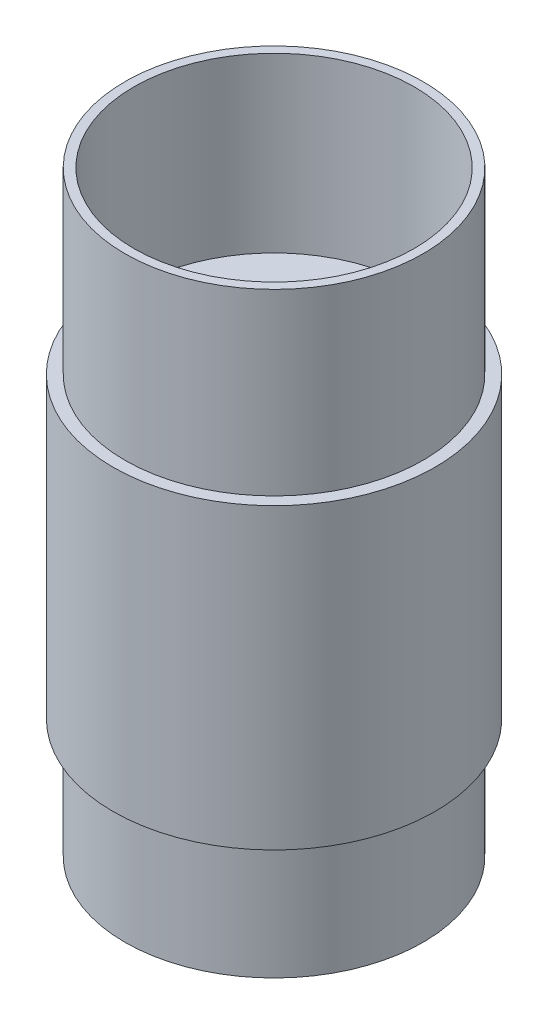
ISO-10303-21;
HEADER;
FILE_DESCRIPTION(('STEP AP214'),'2;1');
FILE_NAME('part.step','',(''),(''),'','','');
FILE_SCHEMA(('AUTOMOTIVE_DESIGN { 1 0 10303 214 1 1 1 1 }'));
ENDSEC;
DATA;
#1=APPLICATION_CONTEXT('core data for automotive mechanical design processes');
#2=APPLICATION_PROTOCOL_DEFINITION('international standard','automotive_design',2000,#1);
#3=PRODUCT_CONTEXT('',#1,'mechanical');
#4=PRODUCT('Part','Part','',(#3));
#5=PRODUCT_RELATED_PRODUCT_CATEGORY('part','',(#4));
#6=PRODUCT_DEFINITION_FORMATION('','',#4);
#7=PRODUCT_DEFINITION_CONTEXT('part definition',#1,'design');
#8=PRODUCT_DEFINITION('design','',#6,#7);
#9=PRODUCT_DEFINITION_SHAPE('','',#8);
#10=(LENGTH_UNIT() NAMED_UNIT(*) SI_UNIT(.MILLI.,.METRE.));
#11=(NAMED_UNIT(*) PLANE_ANGLE_UNIT() SI_UNIT($,.RADIAN.));
#12=(NAMED_UNIT(*) SI_UNIT($,.STERADIAN.) SOLID_ANGLE_UNIT());
#13=UNCERTAINTY_MEASURE_WITH_UNIT(LENGTH_MEASURE(1.E-05),#10,'distance_accuracy_value','');
#14=(GEOMETRIC_REPRESENTATION_CONTEXT(3) GLOBAL_UNCERTAINTY_ASSIGNED_CONTEXT((#13)) GLOBAL_UNIT_ASSIGNED_CONTEXT((#10,
#11,#12)) REPRESENTATION_CONTEXT('',''));
#15=CARTESIAN_POINT('',(0.,0.,0.));
#16=DIRECTION('',(0.,0.,1.));
#17=DIRECTION('',(1.,0.,0.));
#18=AXIS2_PLACEMENT_3D('',#15,#16,#17);
#19=CARTESIAN_POINT('',(0.,100.,0.));
#20=DIRECTION('',(0.,1.,0.));
#21=DIRECTION('',(0.,0.,1.));
#22=AXIS2_PLACEMENT_3D('',#19,#20,#21);
#23=PLANE('',#22);
#24=CARTESIAN_POINT('',(0.,100.,0.));
#25=DIRECTION('',(0.,1.,0.));
#26=DIRECTION('',(0.,0.,1.));
#27=AXIS2_PLACEMENT_3D('',#24,#25,#26);
#28=CIRCLE('',#27,25.);
#29=CARTESIAN_POINT('',(0.,100.,25.));
#30=VERTEX_POINT('',#29);
#31=EDGE_CURVE('E73',#30,#30,#28,.T.);
#32=ORIENTED_EDGE('',*,*,#31,.T.);
#33=EDGE_LOOP('',(#32));
#34=FACE_BOUND('',#33,.T.);
#35=CARTESIAN_POINT('',(0.,100.,0.));
#36=DIRECTION('',(0.,1.,0.));
#37=DIRECTION('',(0.,0.,1.));
#38=AXIS2_PLACEMENT_3D('',#35,#36,#37);
#39=CIRCLE('',#38,23.5);
#40=CARTESIAN_POINT('',(0.,100.,23.5));
#41=VERTEX_POINT('',#40);
#42=EDGE_CURVE('E82',#41,#41,#39,.T.);
#43=ORIENTED_EDGE('',*,*,#42,.F.);
#44=EDGE_LOOP('',(#43));
#45=FACE_BOUND('',#44,.T.);
#46=ADVANCED_FACE('F66',(#34,#45),#23,.T.);
#47=CARTESIAN_POINT('',(0.,70.,0.));
#48=DIRECTION('',(0.,1.,0.));
#49=DIRECTION('',(0.,0.,1.));
#50=AXIS2_PLACEMENT_3D('',#47,#48,#49);
#51=PLANE('',#50);
#52=CARTESIAN_POINT('',(0.,70.,0.));
#53=DIRECTION('',(0.,1.,0.));
#54=DIRECTION('',(0.,0.,1.));
#55=AXIS2_PLACEMENT_3D('',#52,#53,#54);
#56=CIRCLE('',#55,25.);
#57=CARTESIAN_POINT('',(0.,70.,25.));
#58=VERTEX_POINT('',#57);
#59=EDGE_CURVE('E77',#58,#58,#56,.T.);
#60=ORIENTED_EDGE('',*,*,#59,.F.);
#61=EDGE_LOOP('',(#60));
#62=FACE_BOUND('',#61,.T.);
#63=ADVANCED_FACE('F90',(#62),#51,.F.);
#64=CARTESIAN_POINT('',(0.,100.,0.));
#65=DIRECTION('',(0.,-1.,0.));
#66=DIRECTION('',(0.,0.,-1.));
#67=AXIS2_PLACEMENT_3D('',#64,#65,#66);
#68=CYLINDRICAL_SURFACE('',#67,25.);
#69=ORIENTED_EDGE('',*,*,#31,.F.);
#70=EDGE_LOOP('',(#69));
#71=FACE_BOUND('',#70,.T.);
#72=ORIENTED_EDGE('',*,*,#59,.T.);
#73=EDGE_LOOP('',(#72));
#74=FACE_BOUND('',#73,.T.);
#75=ADVANCED_FACE('F68',(#71,#74),#68,.T.);
#76=CARTESIAN_POINT('',(0.,100.,0.));
#77=DIRECTION('',(0.,-1.,0.));
#78=DIRECTION('',(0.,0.,-1.));
#79=AXIS2_PLACEMENT_3D('',#76,#77,#78);
#80=CYLINDRICAL_SURFACE('',#79,23.5);
#81=CARTESIAN_POINT('',(0.,71.,0.));
#82=DIRECTION('',(0.,1.,0.));
#83=DIRECTION('',(0.,0.,1.));
#84=AXIS2_PLACEMENT_3D('',#81,#82,#83);
#85=CIRCLE('',#84,23.5);
#86=CARTESIAN_POINT('',(0.,71.,23.5));
#87=VERTEX_POINT('',#86);
#88=EDGE_CURVE('E12',#87,#87,#85,.T.);
#89=ORIENTED_EDGE('',*,*,#88,.F.);
#90=EDGE_LOOP('',(#89));
#91=FACE_BOUND('',#90,.T.);
#92=ORIENTED_EDGE('',*,*,#42,.T.);
#93=EDGE_LOOP('',(#92));
#94=FACE_BOUND('',#93,.T.);
#95=ADVANCED_FACE('F87',(#91,#94),#80,.F.);
#96=CARTESIAN_POINT('',(0.,71.,0.));
#97=DIRECTION('',(0.,1.,0.));
#98=DIRECTION('',(0.,0.,1.));
#99=AXIS2_PLACEMENT_3D('',#96,#97,#98);
#100=PLANE('',#99);
#101=ORIENTED_EDGE('',*,*,#88,.T.);
#102=EDGE_LOOP('',(#101));
#103=FACE_BOUND('',#102,.T.);
#104=ADVANCED_FACE('F99',(#103),#100,.T.);
#105=CLOSED_SHELL('',(#46,#63,#75,#95,#104));
#106=MANIFOLD_SOLID_BREP('B2',#105);
#107=CARTESIAN_POINT('',(0.,70.,0.));
#108=DIRECTION('',(0.,1.,0.));
#109=DIRECTION('',(0.,0.,1.));
#110=AXIS2_PLACEMENT_3D('',#107,#108,#109);
#111=PLANE('',#110);
#112=CARTESIAN_POINT('',(0.,70.,0.));
#113=DIRECTION('',(0.,1.,0.));
#114=DIRECTION('',(0.,0.,1.));
#115=AXIS2_PLACEMENT_3D('',#112,#113,#114);
#116=CIRCLE('',#115,27.);
#117=CARTESIAN_POINT('',(0.,70.,27.));
#118=VERTEX_POINT('',#117);
#119=EDGE_CURVE('E65',#118,#118,#116,.T.);
#120=ORIENTED_EDGE('',*,*,#119,.T.);
#121=EDGE_LOOP('',(#120));
#122=FACE_BOUND('',#121,.T.);
#123=CARTESIAN_POINT('',(0.,70.,0.));
#124=DIRECTION('',(0.,1.,0.));
#125=DIRECTION('',(0.,0.,1.));
#126=AXIS2_PLACEMENT_3D('',#123,#124,#125);
#127=CIRCLE('',#126,25.);
#128=CARTESIAN_POINT('',(0.,70.,25.));
#129=VERTEX_POINT('',#128);
#130=EDGE_CURVE('E160',#129,#129,#127,.T.);
#131=ORIENTED_EDGE('',*,*,#130,.F.);
#132=EDGE_LOOP('',(#131));
#133=FACE_BOUND('',#132,.T.);
#134=ADVANCED_FACE('F147',(#122,#133),#111,.T.);
#135=CARTESIAN_POINT('',(0.,20.,0.));
#136=DIRECTION('',(0.,1.,0.));
#137=DIRECTION('',(0.,0.,1.));
#138=AXIS2_PLACEMENT_3D('',#135,#136,#137);
#139=PLANE('',#138);
#140=CARTESIAN_POINT('',(0.,20.,0.));
#141=DIRECTION('',(0.,1.,0.));
#142=DIRECTION('',(0.,0.,1.));
#143=AXIS2_PLACEMENT_3D('',#140,#141,#142);
#144=CIRCLE('',#143,27.);
#145=CARTESIAN_POINT('',(0.,20.,27.));
#146=VERTEX_POINT('',#145);
#147=EDGE_CURVE('E151',#146,#146,#144,.T.);
#148=ORIENTED_EDGE('',*,*,#147,.F.);
#149=EDGE_LOOP('',(#148));
#150=FACE_BOUND('',#149,.T.);
#151=CARTESIAN_POINT('',(0.,20.,0.));
#152=DIRECTION('',(0.,1.,0.));
#153=DIRECTION('',(0.,0.,1.));
#154=AXIS2_PLACEMENT_3D('',#151,#152,#153);
#155=CIRCLE('',#154,25.);
#156=CARTESIAN_POINT('',(0.,20.,25.));
#157=VERTEX_POINT('',#156);
#158=EDGE_CURVE('E162',#157,#157,#155,.T.);
#159=ORIENTED_EDGE('',*,*,#158,.T.);
#160=EDGE_LOOP('',(#159));
#161=FACE_BOUND('',#160,.T.);
#162=ADVANCED_FACE('F174',(#150,#161),#139,.F.);
#163=CARTESIAN_POINT('',(0.,70.,0.));
#164=DIRECTION('',(0.,-1.,0.));
#165=DIRECTION('',(0.,0.,-1.));
#166=AXIS2_PLACEMENT_3D('',#163,#164,#165);
#167=CYLINDRICAL_SURFACE('',#166,27.);
#168=ORIENTED_EDGE('',*,*,#119,.F.);
#169=EDGE_LOOP('',(#168));
#170=FACE_BOUND('',#169,.T.);
#171=ORIENTED_EDGE('',*,*,#147,.T.);
#172=EDGE_LOOP('',(#171));
#173=FACE_BOUND('',#172,.T.);
#174=ADVANCED_FACE('F149',(#170,#173),#167,.T.);
#175=CARTESIAN_POINT('',(0.,70.,0.));
#176=DIRECTION('',(0.,-1.,0.));
#177=DIRECTION('',(0.,0.,-1.));
#178=AXIS2_PLACEMENT_3D('',#175,#176,#177);
#179=CYLINDRICAL_SURFACE('',#178,25.);
#180=ORIENTED_EDGE('',*,*,#130,.T.);
#181=EDGE_LOOP('',(#180));
#182=FACE_BOUND('',#181,.T.);
#183=ORIENTED_EDGE('',*,*,#158,.F.);
#184=EDGE_LOOP('',(#183));
#185=FACE_BOUND('',#184,.T.);
#186=ADVANCED_FACE('F170',(#182,#185),#179,.F.);
#187=CLOSED_SHELL('',(#134,#162,#174,#186));
#188=MANIFOLD_SOLID_BREP('B7',#187);
#189=CARTESIAN_POINT('',(0.,20.,0.));
#190=DIRECTION('',(0.,1.,0.));
#191=DIRECTION('',(0.,0.,1.));
#192=AXIS2_PLACEMENT_3D('',#189,#190,#191);
#193=PLANE('',#192);
#194=CARTESIAN_POINT('',(0.,20.,0.));
#195=DIRECTION('',(0.,1.,0.));
#196=DIRECTION('',(0.,0.,1.));
#197=AXIS2_PLACEMENT_3D('',#194,#195,#196);
#198=CIRCLE('',#197,25.);
#199=CARTESIAN_POINT('',(0.,20.,25.));
#200=VERTEX_POINT('',#199);
#201=EDGE_CURVE('E146',#200,#200,#198,.T.);
#202=ORIENTED_EDGE('',*,*,#201,.T.);
#203=EDGE_LOOP('',(#202));
#204=FACE_BOUND('',#203,.T.);
#205=CARTESIAN_POINT('',(0.,20.,0.));
#206=DIRECTION('',(0.,1.,0.));
#207=DIRECTION('',(0.,0.,1.));
#208=AXIS2_PLACEMENT_3D('',#205,#206,#207);
#209=CIRCLE('',#208,23.5);
#210=CARTESIAN_POINT('',(0.,20.,23.5));
#211=VERTEX_POINT('',#210);
#212=EDGE_CURVE('E224',#211,#211,#209,.T.);
#213=ORIENTED_EDGE('',*,*,#212,.F.);
#214=EDGE_LOOP('',(#213));
#215=FACE_BOUND('',#214,.T.);
#216=ADVANCED_FACE('F213',(#204,#215),#193,.T.);
#217=CARTESIAN_POINT('',(0.,0.,0.));
#218=DIRECTION('',(0.,1.,0.));
#219=DIRECTION('',(0.,0.,1.));
#220=AXIS2_PLACEMENT_3D('',#217,#218,#219);
#221=PLANE('',#220);
#222=CARTESIAN_POINT('',(0.,0.,0.));
#223=DIRECTION('',(0.,1.,0.));
#224=DIRECTION('',(0.,0.,1.));
#225=AXIS2_PLACEMENT_3D('',#222,#223,#224);
#226=CIRCLE('',#225,25.);
#227=CARTESIAN_POINT('',(0.,0.,25.));
#228=VERTEX_POINT('',#227);
#229=EDGE_CURVE('E217',#228,#228,#226,.T.);
#230=ORIENTED_EDGE('',*,*,#229,.F.);
#231=EDGE_LOOP('',(#230));
#232=FACE_BOUND('',#231,.T.);
#233=CARTESIAN_POINT('',(0.,0.,0.));
#234=DIRECTION('',(0.,1.,0.));
#235=DIRECTION('',(0.,0.,1.));
#236=AXIS2_PLACEMENT_3D('',#233,#234,#235);
#237=CIRCLE('',#236,23.5);
#238=CARTESIAN_POINT('',(0.,0.,23.5));
#239=VERTEX_POINT('',#238);
#240=EDGE_CURVE('E226',#239,#239,#237,.T.);
#241=ORIENTED_EDGE('',*,*,#240,.T.);
#242=EDGE_LOOP('',(#241));
#243=FACE_BOUND('',#242,.T.);
#244=ADVANCED_FACE('F236',(#232,#243),#221,.F.);
#245=CARTESIAN_POINT('',(0.,20.,0.));
#246=DIRECTION('',(0.,-1.,0.));
#247=DIRECTION('',(0.,0.,-1.));
#248=AXIS2_PLACEMENT_3D('',#245,#246,#247);
#249=CYLINDRICAL_SURFACE('',#248,25.);
#250=ORIENTED_EDGE('',*,*,#201,.F.);
#251=EDGE_LOOP('',(#250));
#252=FACE_BOUND('',#251,.T.);
#253=ORIENTED_EDGE('',*,*,#229,.T.);
#254=EDGE_LOOP('',(#253));
#255=FACE_BOUND('',#254,.T.);
#256=ADVANCED_FACE('F215',(#252,#255),#249,.T.);
#257=CARTESIAN_POINT('',(0.,20.,0.));
#258=DIRECTION('',(0.,-1.,0.));
#259=DIRECTION('',(0.,0.,-1.));
#260=AXIS2_PLACEMENT_3D('',#257,#258,#259);
#261=CYLINDRICAL_SURFACE('',#260,23.5);
#262=ORIENTED_EDGE('',*,*,#212,.T.);
#263=EDGE_LOOP('',(#262));
#264=FACE_BOUND('',#263,.T.);
#265=ORIENTED_EDGE('',*,*,#240,.F.);
#266=EDGE_LOOP('',(#265));
#267=FACE_BOUND('',#266,.T.);
#268=ADVANCED_FACE('F232',(#264,#267),#261,.F.);
#269=CLOSED_SHELL('',(#216,#244,#256,#268));
#270=MANIFOLD_SOLID_BREP('B60',#269);
#271=ADVANCED_BREP_SHAPE_REPRESENTATION('',(#18,#106,#188,#270),#14);
#272=SHAPE_DEFINITION_REPRESENTATION(#9,#271);
ENDSEC;
END-ISO-10303-21;
